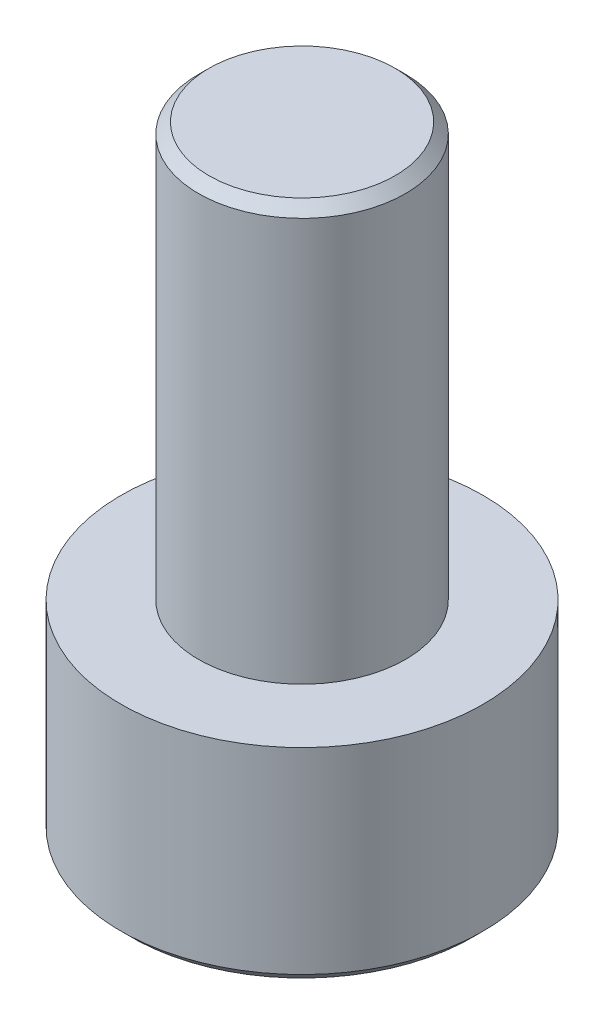
ISO-10303-21;
HEADER;
FILE_DESCRIPTION(('STEP AP214'),'2;1');
FILE_NAME('part.step','',(''),(''),'','','');
FILE_SCHEMA(('AUTOMOTIVE_DESIGN { 1 0 10303 214 1 1 1 1 }'));
ENDSEC;
DATA;
#1=APPLICATION_CONTEXT('core data for automotive mechanical design processes');
#2=APPLICATION_PROTOCOL_DEFINITION('international standard','automotive_design',2000,#1);
#3=PRODUCT_CONTEXT('',#1,'mechanical');
#4=PRODUCT('Part','Part','',(#3));
#5=PRODUCT_RELATED_PRODUCT_CATEGORY('part','',(#4));
#6=PRODUCT_DEFINITION_FORMATION('','',#4);
#7=PRODUCT_DEFINITION_CONTEXT('part definition',#1,'design');
#8=PRODUCT_DEFINITION('design','',#6,#7);
#9=PRODUCT_DEFINITION_SHAPE('','',#8);
#10=(LENGTH_UNIT() NAMED_UNIT(*) SI_UNIT(.MILLI.,.METRE.));
#11=(NAMED_UNIT(*) PLANE_ANGLE_UNIT() SI_UNIT($,.RADIAN.));
#12=(NAMED_UNIT(*) SI_UNIT($,.STERADIAN.) SOLID_ANGLE_UNIT());
#13=UNCERTAINTY_MEASURE_WITH_UNIT(LENGTH_MEASURE(1.E-05),#10,'distance_accuracy_value','');
#14=(GEOMETRIC_REPRESENTATION_CONTEXT(3) GLOBAL_UNCERTAINTY_ASSIGNED_CONTEXT((#13)) GLOBAL_UNIT_ASSIGNED_CONTEXT((#10,
#11,#12)) REPRESENTATION_CONTEXT('',''));
#15=CARTESIAN_POINT('',(0.,0.,0.));
#16=DIRECTION('',(0.,0.,1.));
#17=DIRECTION('',(1.,0.,0.));
#18=AXIS2_PLACEMENT_3D('',#15,#16,#17);
#19=CARTESIAN_POINT('',(0.,-4.,0.));
#20=DIRECTION('',(0.,-1.,0.));
#21=DIRECTION('',(0.,0.,-1.));
#22=AXIS2_PLACEMENT_3D('',#19,#20,#21);
#23=PLANE('',#22);
#24=CARTESIAN_POINT('',(0.,-4.,0.));
#25=DIRECTION('',(0.,-1.,0.));
#26=DIRECTION('',(0.,0.,-1.));
#27=AXIS2_PLACEMENT_3D('',#24,#25,#26);
#28=CIRCLE('',#27,3.3);
#29=CARTESIAN_POINT('',(0.,-4.,-3.3));
#30=VERTEX_POINT('',#29);
#31=EDGE_CURVE('E11',#30,#30,#28,.T.);
#32=ORIENTED_EDGE('',*,*,#31,.T.);
#33=EDGE_LOOP('',(#32));
#34=FACE_BOUND('',#33,.T.);
#35=DIRECTION('',(0.5,0.,-0.866025403784439));
#36=VECTOR('',#35,1.);
#37=CARTESIAN_POINT('',(1.73205080756888,-4.,0.));
#38=LINE('',#37,#36);
#39=CARTESIAN_POINT('',(0.866025403784439,-4.,1.5));
#40=VERTEX_POINT('',#39);
#41=CARTESIAN_POINT('',(1.73205080756888,-4.,0.));
#42=VERTEX_POINT('',#41);
#43=EDGE_CURVE('E131',#40,#42,#38,.T.);
#44=ORIENTED_EDGE('',*,*,#43,.T.);
#45=DIRECTION('',(-0.5,0.,-0.866025403784439));
#46=VECTOR('',#45,1.);
#47=CARTESIAN_POINT('',(0.866025403784439,-4.,-1.5));
#48=LINE('',#47,#46);
#49=CARTESIAN_POINT('',(0.866025403784439,-4.,-1.5));
#50=VERTEX_POINT('',#49);
#51=EDGE_CURVE('E51',#42,#50,#48,.T.);
#52=ORIENTED_EDGE('',*,*,#51,.T.);
#53=DIRECTION('',(-1.,0.,0.));
#54=VECTOR('',#53,1.);
#55=CARTESIAN_POINT('',(-0.866025403784439,-4.,-1.5));
#56=LINE('',#55,#54);
#57=CARTESIAN_POINT('',(-0.866025403784439,-4.,-1.5));
#58=VERTEX_POINT('',#57);
#59=EDGE_CURVE('E122',#50,#58,#56,.T.);
#60=ORIENTED_EDGE('',*,*,#59,.T.);
#61=DIRECTION('',(-0.5,0.,0.866025403784439));
#62=VECTOR('',#61,1.);
#63=CARTESIAN_POINT('',(-1.73205080756888,-4.,0.));
#64=LINE('',#63,#62);
#65=CARTESIAN_POINT('',(-1.73205080756888,-4.,0.));
#66=VERTEX_POINT('',#65);
#67=EDGE_CURVE('E125',#58,#66,#64,.T.);
#68=ORIENTED_EDGE('',*,*,#67,.T.);
#69=DIRECTION('',(0.5,0.,0.866025403784439));
#70=VECTOR('',#69,1.);
#71=CARTESIAN_POINT('',(-0.866025403784438,-4.,1.5));
#72=LINE('',#71,#70);
#73=CARTESIAN_POINT('',(-0.866025403784438,-4.,1.5));
#74=VERTEX_POINT('',#73);
#75=EDGE_CURVE('E128',#66,#74,#72,.T.);
#76=ORIENTED_EDGE('',*,*,#75,.T.);
#77=DIRECTION('',(1.,0.,0.));
#78=VECTOR('',#77,1.);
#79=CARTESIAN_POINT('',(0.866025403784439,-4.,1.5));
#80=LINE('',#79,#78);
#81=EDGE_CURVE('E112',#74,#40,#80,.T.);
#82=ORIENTED_EDGE('',*,*,#81,.T.);
#83=EDGE_LOOP('',(#44,#52,#60,#68,#76,#82));
#84=FACE_BOUND('',#83,.T.);
#85=ADVANCED_FACE('F37',(#34,#84),#23,.T.);
#86=CARTESIAN_POINT('',(0.,-4.,0.));
#87=DIRECTION('',(0.,1.,0.));
#88=DIRECTION('',(0.,0.,1.));
#89=AXIS2_PLACEMENT_3D('',#86,#87,#88);
#90=CONICAL_SURFACE('',#89,3.3,0.785398163397504);
#91=CARTESIAN_POINT('',(0.,-3.80000000000003,0.));
#92=DIRECTION('',(0.,-1.,0.));
#93=DIRECTION('',(0.,0.,-1.));
#94=AXIS2_PLACEMENT_3D('',#91,#92,#93);
#95=CIRCLE('',#94,3.5);
#96=CARTESIAN_POINT('',(0.,-3.80000000000003,-3.5));
#97=VERTEX_POINT('',#96);
#98=EDGE_CURVE('E44',#97,#97,#95,.T.);
#99=ORIENTED_EDGE('',*,*,#98,.T.);
#100=EDGE_LOOP('',(#99));
#101=FACE_BOUND('',#100,.T.);
#102=ORIENTED_EDGE('',*,*,#31,.F.);
#103=EDGE_LOOP('',(#102));
#104=FACE_BOUND('',#103,.T.);
#105=ADVANCED_FACE('F156',(#101,#104),#90,.T.);
#106=CARTESIAN_POINT('',(0.,-500.,0.));
#107=DIRECTION('',(0.,-1.,0.));
#108=DIRECTION('',(0.,0.,-1.));
#109=AXIS2_PLACEMENT_3D('',#106,#107,#108);
#110=CYLINDRICAL_SURFACE('',#109,3.5);
#111=CARTESIAN_POINT('',(0.,0.,0.));
#112=DIRECTION('',(0.,-1.,0.));
#113=DIRECTION('',(0.,0.,-1.));
#114=AXIS2_PLACEMENT_3D('',#111,#112,#113);
#115=CIRCLE('',#114,3.5);
#116=CARTESIAN_POINT('',(0.,0.,-3.5));
#117=VERTEX_POINT('',#116);
#118=EDGE_CURVE('E151',#117,#117,#115,.T.);
#119=ORIENTED_EDGE('',*,*,#118,.T.);
#120=EDGE_LOOP('',(#119));
#121=FACE_BOUND('',#120,.T.);
#122=ORIENTED_EDGE('',*,*,#98,.F.);
#123=EDGE_LOOP('',(#122));
#124=FACE_BOUND('',#123,.T.);
#125=ADVANCED_FACE('F159',(#121,#124),#110,.T.);
#126=CARTESIAN_POINT('',(3.5,0.,0.));
#127=DIRECTION('',(0.,1.,0.));
#128=DIRECTION('',(0.,0.,1.));
#129=AXIS2_PLACEMENT_3D('',#126,#127,#128);
#130=PLANE('',#129);
#131=CARTESIAN_POINT('',(0.,0.,0.));
#132=DIRECTION('',(0.,-1.,0.));
#133=DIRECTION('',(0.,0.,-1.));
#134=AXIS2_PLACEMENT_3D('',#131,#132,#133);
#135=CIRCLE('',#134,2.);
#136=CARTESIAN_POINT('',(0.,0.,-2.));
#137=VERTEX_POINT('',#136);
#138=EDGE_CURVE('E148',#137,#137,#135,.T.);
#139=ORIENTED_EDGE('',*,*,#138,.T.);
#140=EDGE_LOOP('',(#139));
#141=FACE_BOUND('',#140,.T.);
#142=ORIENTED_EDGE('',*,*,#118,.F.);
#143=EDGE_LOOP('',(#142));
#144=FACE_BOUND('',#143,.T.);
#145=ADVANCED_FACE('F161',(#141,#144),#130,.T.);
#146=CARTESIAN_POINT('',(0.,-500.,0.));
#147=DIRECTION('',(0.,-1.,0.));
#148=DIRECTION('',(0.,0.,-1.));
#149=AXIS2_PLACEMENT_3D('',#146,#147,#148);
#150=CYLINDRICAL_SURFACE('',#149,2.);
#151=CARTESIAN_POINT('',(0.,7.80000000000003,0.));
#152=DIRECTION('',(0.,-1.,0.));
#153=DIRECTION('',(0.,0.,-1.));
#154=AXIS2_PLACEMENT_3D('',#151,#152,#153);
#155=CIRCLE('',#154,2.);
#156=CARTESIAN_POINT('',(0.,7.80000000000003,-2.));
#157=VERTEX_POINT('',#156);
#158=EDGE_CURVE('E145',#157,#157,#155,.T.);
#159=ORIENTED_EDGE('',*,*,#158,.T.);
#160=EDGE_LOOP('',(#159));
#161=FACE_BOUND('',#160,.T.);
#162=ORIENTED_EDGE('',*,*,#138,.F.);
#163=EDGE_LOOP('',(#162));
#164=FACE_BOUND('',#163,.T.);
#165=ADVANCED_FACE('F168',(#161,#164),#150,.T.);
#166=CARTESIAN_POINT('',(0.,7.80000000000003,0.));
#167=DIRECTION('',(0.,-1.,0.));
#168=DIRECTION('',(0.,0.,-1.));
#169=AXIS2_PLACEMENT_3D('',#166,#167,#168);
#170=CONICAL_SURFACE('',#169,2.,0.785398163397504);
#171=CARTESIAN_POINT('',(0.,8.00000000000001,0.));
#172=DIRECTION('',(0.,-1.,0.));
#173=DIRECTION('',(0.,0.,-1.));
#174=AXIS2_PLACEMENT_3D('',#171,#172,#173);
#175=CIRCLE('',#174,1.8);
#176=CARTESIAN_POINT('',(0.,8.00000000000001,-1.8));
#177=VERTEX_POINT('',#176);
#178=EDGE_CURVE('E142',#177,#177,#175,.T.);
#179=ORIENTED_EDGE('',*,*,#178,.T.);
#180=EDGE_LOOP('',(#179));
#181=FACE_BOUND('',#180,.T.);
#182=ORIENTED_EDGE('',*,*,#158,.F.);
#183=EDGE_LOOP('',(#182));
#184=FACE_BOUND('',#183,.T.);
#185=ADVANCED_FACE('F201',(#181,#184),#170,.T.);
#186=CARTESIAN_POINT('',(1.8,8.,0.));
#187=DIRECTION('',(0.,1.,0.));
#188=DIRECTION('',(0.,0.,1.));
#189=AXIS2_PLACEMENT_3D('',#186,#187,#188);
#190=PLANE('',#189);
#191=ORIENTED_EDGE('',*,*,#178,.F.);
#192=EDGE_LOOP('',(#191));
#193=FACE_BOUND('',#192,.T.);
#194=ADVANCED_FACE('F195',(#193),#190,.T.);
#195=CARTESIAN_POINT('',(0.866025403784439,-2.,-1.5));
#196=DIRECTION('',(-0.866025403784439,0.,0.5));
#197=DIRECTION('',(0.5,0.,0.866025403784439));
#198=AXIS2_PLACEMENT_3D('',#195,#196,#197);
#199=PLANE('',#198);
#200=ORIENTED_EDGE('',*,*,#51,.F.);
#201=DIRECTION('',(0.,-1.,0.));
#202=VECTOR('',#201,1.);
#203=CARTESIAN_POINT('',(1.73205080756888,-2.,0.));
#204=LINE('',#203,#202);
#205=CARTESIAN_POINT('',(1.73205080756888,-2.,0.));
#206=VERTEX_POINT('',#205);
#207=EDGE_CURVE('E117',#206,#42,#204,.T.);
#208=ORIENTED_EDGE('',*,*,#207,.F.);
#209=DIRECTION('',(-0.5,0.,-0.866025403784439));
#210=VECTOR('',#209,1.);
#211=CARTESIAN_POINT('',(0.866025403784439,-2.,-1.5));
#212=LINE('',#211,#210);
#213=CARTESIAN_POINT('',(0.866025403784439,-2.,-1.5));
#214=VERTEX_POINT('',#213);
#215=EDGE_CURVE('E134',#206,#214,#212,.T.);
#216=ORIENTED_EDGE('',*,*,#215,.T.);
#217=DIRECTION('',(0.,-1.,0.));
#218=VECTOR('',#217,1.);
#219=CARTESIAN_POINT('',(0.866025403784439,-2.,-1.5));
#220=LINE('',#219,#218);
#221=EDGE_CURVE('E140',#214,#50,#220,.T.);
#222=ORIENTED_EDGE('',*,*,#221,.T.);
#223=EDGE_LOOP('',(#200,#208,#216,#222));
#224=FACE_BOUND('',#223,.T.);
#225=ADVANCED_FACE('F178',(#224),#199,.T.);
#226=CARTESIAN_POINT('',(-0.866025403784439,-2.,-1.5));
#227=DIRECTION('',(0.,0.,1.));
#228=DIRECTION('',(1.,0.,0.));
#229=AXIS2_PLACEMENT_3D('',#226,#227,#228);
#230=PLANE('',#229);
#231=ORIENTED_EDGE('',*,*,#59,.F.);
#232=ORIENTED_EDGE('',*,*,#221,.F.);
#233=DIRECTION('',(-1.,0.,0.));
#234=VECTOR('',#233,1.);
#235=CARTESIAN_POINT('',(-0.866025403784439,-2.,-1.5));
#236=LINE('',#235,#234);
#237=CARTESIAN_POINT('',(-0.866025403784439,-2.,-1.5));
#238=VERTEX_POINT('',#237);
#239=EDGE_CURVE('E90',#214,#238,#236,.T.);
#240=ORIENTED_EDGE('',*,*,#239,.T.);
#241=DIRECTION('',(0.,-1.,0.));
#242=VECTOR('',#241,1.);
#243=CARTESIAN_POINT('',(-0.866025403784439,-2.,-1.5));
#244=LINE('',#243,#242);
#245=EDGE_CURVE('E138',#238,#58,#244,.T.);
#246=ORIENTED_EDGE('',*,*,#245,.T.);
#247=EDGE_LOOP('',(#231,#232,#240,#246));
#248=FACE_BOUND('',#247,.T.);
#249=ADVANCED_FACE('F187',(#248),#230,.T.);
#250=CARTESIAN_POINT('',(-1.73205080756888,-2.,0.));
#251=DIRECTION('',(0.866025403784439,0.,0.5));
#252=DIRECTION('',(0.5,0.,-0.866025403784439));
#253=AXIS2_PLACEMENT_3D('',#250,#251,#252);
#254=PLANE('',#253);
#255=ORIENTED_EDGE('',*,*,#67,.F.);
#256=ORIENTED_EDGE('',*,*,#245,.F.);
#257=DIRECTION('',(-0.5,0.,0.866025403784439));
#258=VECTOR('',#257,1.);
#259=CARTESIAN_POINT('',(-1.73205080756888,-2.,0.));
#260=LINE('',#259,#258);
#261=CARTESIAN_POINT('',(-1.73205080756888,-2.,0.));
#262=VERTEX_POINT('',#261);
#263=EDGE_CURVE('E108',#238,#262,#260,.T.);
#264=ORIENTED_EDGE('',*,*,#263,.T.);
#265=DIRECTION('',(0.,-1.,0.));
#266=VECTOR('',#265,1.);
#267=CARTESIAN_POINT('',(-1.73205080756888,-2.,0.));
#268=LINE('',#267,#266);
#269=EDGE_CURVE('E105',#262,#66,#268,.T.);
#270=ORIENTED_EDGE('',*,*,#269,.T.);
#271=EDGE_LOOP('',(#255,#256,#264,#270));
#272=FACE_BOUND('',#271,.T.);
#273=ADVANCED_FACE('F185',(#272),#254,.T.);
#274=CARTESIAN_POINT('',(-0.866025403784438,-2.,1.5));
#275=DIRECTION('',(0.866025403784439,0.,-0.5));
#276=DIRECTION('',(-0.5,0.,-0.866025403784439));
#277=AXIS2_PLACEMENT_3D('',#274,#275,#276);
#278=PLANE('',#277);
#279=ORIENTED_EDGE('',*,*,#75,.F.);
#280=ORIENTED_EDGE('',*,*,#269,.F.);
#281=DIRECTION('',(0.5,0.,0.866025403784439));
#282=VECTOR('',#281,1.);
#283=CARTESIAN_POINT('',(-0.866025403784438,-2.,1.5));
#284=LINE('',#283,#282);
#285=CARTESIAN_POINT('',(-0.866025403784438,-2.,1.5));
#286=VERTEX_POINT('',#285);
#287=EDGE_CURVE('E100',#262,#286,#284,.T.);
#288=ORIENTED_EDGE('',*,*,#287,.T.);
#289=DIRECTION('',(0.,-1.,0.));
#290=VECTOR('',#289,1.);
#291=CARTESIAN_POINT('',(-0.866025403784438,-2.,1.5));
#292=LINE('',#291,#290);
#293=EDGE_CURVE('E104',#286,#74,#292,.T.);
#294=ORIENTED_EDGE('',*,*,#293,.T.);
#295=EDGE_LOOP('',(#279,#280,#288,#294));
#296=FACE_BOUND('',#295,.T.);
#297=ADVANCED_FACE('F103',(#296),#278,.T.);
#298=CARTESIAN_POINT('',(0.866025403784439,-2.,1.5));
#299=DIRECTION('',(0.,0.,-1.));
#300=DIRECTION('',(-1.,0.,0.));
#301=AXIS2_PLACEMENT_3D('',#298,#299,#300);
#302=PLANE('',#301);
#303=ORIENTED_EDGE('',*,*,#81,.F.);
#304=ORIENTED_EDGE('',*,*,#293,.F.);
#305=DIRECTION('',(1.,0.,0.));
#306=VECTOR('',#305,1.);
#307=CARTESIAN_POINT('',(0.866025403784439,-2.,1.5));
#308=LINE('',#307,#306);
#309=CARTESIAN_POINT('',(0.866025403784439,-2.,1.5));
#310=VERTEX_POINT('',#309);
#311=EDGE_CURVE('E107',#286,#310,#308,.T.);
#312=ORIENTED_EDGE('',*,*,#311,.T.);
#313=DIRECTION('',(0.,-1.,0.));
#314=VECTOR('',#313,1.);
#315=CARTESIAN_POINT('',(0.866025403784439,-2.,1.5));
#316=LINE('',#315,#314);
#317=EDGE_CURVE('E81',#310,#40,#316,.T.);
#318=ORIENTED_EDGE('',*,*,#317,.T.);
#319=EDGE_LOOP('',(#303,#304,#312,#318));
#320=FACE_BOUND('',#319,.T.);
#321=ADVANCED_FACE('F110',(#320),#302,.T.);
#322=CARTESIAN_POINT('',(1.73205080756888,-2.,0.));
#323=DIRECTION('',(-0.866025403784439,0.,-0.5));
#324=DIRECTION('',(-0.5,0.,0.866025403784439));
#325=AXIS2_PLACEMENT_3D('',#322,#323,#324);
#326=PLANE('',#325);
#327=ORIENTED_EDGE('',*,*,#43,.F.);
#328=ORIENTED_EDGE('',*,*,#317,.F.);
#329=DIRECTION('',(0.5,0.,-0.866025403784439));
#330=VECTOR('',#329,1.);
#331=CARTESIAN_POINT('',(1.73205080756888,-2.,0.));
#332=LINE('',#331,#330);
#333=EDGE_CURVE('E59',#310,#206,#332,.T.);
#334=ORIENTED_EDGE('',*,*,#333,.T.);
#335=ORIENTED_EDGE('',*,*,#207,.T.);
#336=EDGE_LOOP('',(#327,#328,#334,#335));
#337=FACE_BOUND('',#336,.T.);
#338=ADVANCED_FACE('F177',(#337),#326,.T.);
#339=CARTESIAN_POINT('',(0.,-2.,0.));
#340=DIRECTION('',(0.,-1.,0.));
#341=DIRECTION('',(0.,0.,-1.));
#342=AXIS2_PLACEMENT_3D('',#339,#340,#341);
#343=PLANE('',#342);
#344=ORIENTED_EDGE('',*,*,#215,.F.);
#345=ORIENTED_EDGE('',*,*,#333,.F.);
#346=ORIENTED_EDGE('',*,*,#311,.F.);
#347=ORIENTED_EDGE('',*,*,#287,.F.);
#348=ORIENTED_EDGE('',*,*,#263,.F.);
#349=ORIENTED_EDGE('',*,*,#239,.F.);
#350=EDGE_LOOP('',(#344,#345,#346,#347,#348,#349));
#351=FACE_BOUND('',#350,.T.);
#352=ADVANCED_FACE('F115',(#351),#343,.T.);
#353=CLOSED_SHELL('',(#85,#105,#125,#145,#165,#185,#194,#225,#249,#273,#297,#321,#338,#352));
#354=MANIFOLD_SOLID_BREP('B2',#353);
#355=ADVANCED_BREP_SHAPE_REPRESENTATION('',(#18,#354),#14);
#356=SHAPE_DEFINITION_REPRESENTATION(#9,#355);
ENDSEC;
END-ISO-10303-21;
